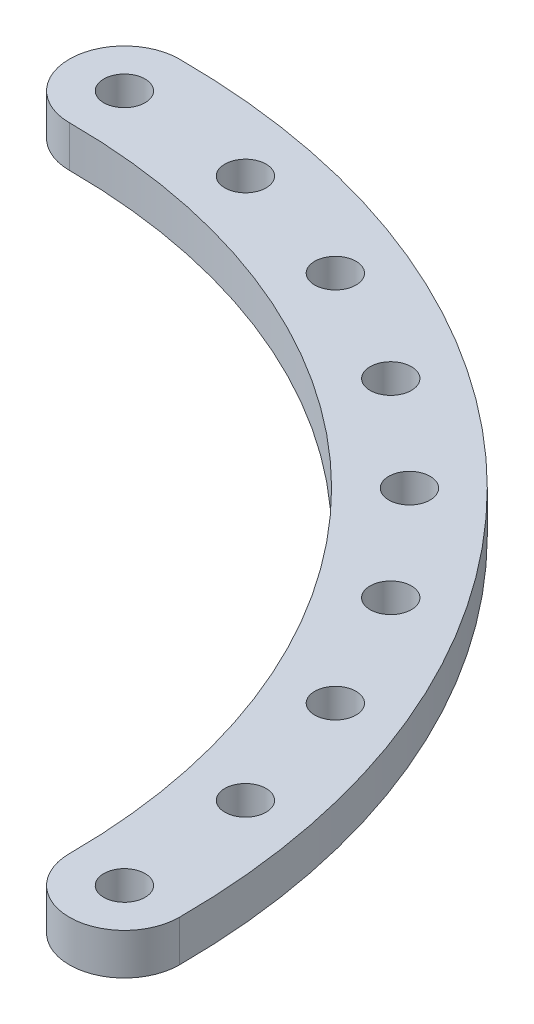
ISO-10303-21;
HEADER;
FILE_DESCRIPTION(('STEP AP214'),'2;1');
FILE_NAME('part.step','',(''),(''),'','','');
FILE_SCHEMA(('AUTOMOTIVE_DESIGN { 1 0 10303 214 1 1 1 1 }'));
ENDSEC;
DATA;
#1=APPLICATION_CONTEXT('core data for automotive mechanical design processes');
#2=APPLICATION_PROTOCOL_DEFINITION('international standard','automotive_design',2000,#1);
#3=PRODUCT_CONTEXT('',#1,'mechanical');
#4=PRODUCT('Part','Part','',(#3));
#5=PRODUCT_RELATED_PRODUCT_CATEGORY('part','',(#4));
#6=PRODUCT_DEFINITION_FORMATION('','',#4);
#7=PRODUCT_DEFINITION_CONTEXT('part definition',#1,'design');
#8=PRODUCT_DEFINITION('design','',#6,#7);
#9=PRODUCT_DEFINITION_SHAPE('','',#8);
#10=(LENGTH_UNIT() NAMED_UNIT(*) SI_UNIT(.MILLI.,.METRE.));
#11=(NAMED_UNIT(*) PLANE_ANGLE_UNIT() SI_UNIT($,.RADIAN.));
#12=(NAMED_UNIT(*) SI_UNIT($,.STERADIAN.) SOLID_ANGLE_UNIT());
#13=UNCERTAINTY_MEASURE_WITH_UNIT(LENGTH_MEASURE(1.E-05),#10,'distance_accuracy_value','');
#14=(GEOMETRIC_REPRESENTATION_CONTEXT(3) GLOBAL_UNCERTAINTY_ASSIGNED_CONTEXT((#13)) GLOBAL_UNIT_ASSIGNED_CONTEXT((#10,
#11,#12)) REPRESENTATION_CONTEXT('',''));
#15=CARTESIAN_POINT('',(0.,0.,0.));
#16=DIRECTION('',(0.,0.,1.));
#17=DIRECTION('',(1.,0.,0.));
#18=AXIS2_PLACEMENT_3D('',#15,#16,#17);
#19=CARTESIAN_POINT('',(0.,3.,0.));
#20=DIRECTION('',(0.,1.,0.));
#21=DIRECTION('',(0.,0.,1.));
#22=AXIS2_PLACEMENT_3D('',#19,#20,#21);
#23=PLANE('',#22);
#24=CARTESIAN_POINT('',(50.0000000000042,3.,-4.25254075506806E-12));
#25=DIRECTION('',(0.,1.,0.));
#26=DIRECTION('',(0.,0.,1.));
#27=AXIS2_PLACEMENT_3D('',#24,#25,#26);
#28=CIRCLE('',#27,1.5);
#29=CARTESIAN_POINT('',(50.0000000000042,3.,1.49999999999575));
#30=VERTEX_POINT('',#29);
#31=EDGE_CURVE('E94',#30,#30,#28,.T.);
#32=ORIENTED_EDGE('',*,*,#31,.F.);
#33=EDGE_LOOP('',(#32));
#34=FACE_BOUND('',#33,.T.);
#35=CARTESIAN_POINT('',(49.0392640201649,3.,-9.75451610081059));
#36=DIRECTION('',(0.,1.,0.));
#37=DIRECTION('',(0.,0.,1.));
#38=AXIS2_PLACEMENT_3D('',#35,#36,#37);
#39=CIRCLE('',#38,1.5);
#40=CARTESIAN_POINT('',(49.0392640201649,3.,-8.25451610081058));
#41=VERTEX_POINT('',#40);
#42=EDGE_CURVE('E96',#41,#41,#39,.T.);
#43=ORIENTED_EDGE('',*,*,#42,.F.);
#44=EDGE_LOOP('',(#43));
#45=FACE_BOUND('',#44,.T.);
#46=CARTESIAN_POINT('',(46.193976625567,3.,-19.1341716182584));
#47=DIRECTION('',(0.,1.,0.));
#48=DIRECTION('',(0.,0.,1.));
#49=AXIS2_PLACEMENT_3D('',#46,#47,#48);
#50=CIRCLE('',#49,1.5);
#51=CARTESIAN_POINT('',(46.193976625567,3.,-17.6341716182584));
#52=VERTEX_POINT('',#51);
#53=EDGE_CURVE('E145',#52,#52,#50,.T.);
#54=ORIENTED_EDGE('',*,*,#53,.F.);
#55=EDGE_LOOP('',(#54));
#56=FACE_BOUND('',#55,.T.);
#57=CARTESIAN_POINT('',(41.5734806151291,3.,-27.7785116509836));
#58=DIRECTION('',(0.,1.,0.));
#59=DIRECTION('',(0.,0.,1.));
#60=AXIS2_PLACEMENT_3D('',#57,#58,#59);
#61=CIRCLE('',#60,1.5);
#62=CARTESIAN_POINT('',(41.5734806151291,3.,-26.2785116509836));
#63=VERTEX_POINT('',#62);
#64=EDGE_CURVE('E142',#63,#63,#61,.T.);
#65=ORIENTED_EDGE('',*,*,#64,.F.);
#66=EDGE_LOOP('',(#65));
#67=FACE_BOUND('',#66,.T.);
#68=CARTESIAN_POINT('',(35.3553390593286,3.,-35.3553390593304));
#69=DIRECTION('',(0.,1.,0.));
#70=DIRECTION('',(0.,0.,1.));
#71=AXIS2_PLACEMENT_3D('',#68,#69,#70);
#72=CIRCLE('',#71,1.5);
#73=CARTESIAN_POINT('',(35.3553390593286,3.,-33.8553390593304));
#74=VERTEX_POINT('',#73);
#75=EDGE_CURVE('E139',#74,#74,#72,.T.);
#76=ORIENTED_EDGE('',*,*,#75,.F.);
#77=EDGE_LOOP('',(#76));
#78=FACE_BOUND('',#77,.T.);
#79=CARTESIAN_POINT('',(27.7785116509808,3.,-41.5734806151296));
#80=DIRECTION('',(0.,1.,0.));
#81=DIRECTION('',(0.,0.,1.));
#82=AXIS2_PLACEMENT_3D('',#79,#80,#81);
#83=CIRCLE('',#82,1.5000000000001);
#84=CARTESIAN_POINT('',(27.7785116509808,3.,-40.0734806151295));
#85=VERTEX_POINT('',#84);
#86=EDGE_CURVE('E136',#85,#85,#83,.T.);
#87=ORIENTED_EDGE('',*,*,#86,.F.);
#88=EDGE_LOOP('',(#87));
#89=FACE_BOUND('',#88,.T.);
#90=CARTESIAN_POINT('',(19.1341716182548,3.,-46.193976625566));
#91=DIRECTION('',(0.,1.,0.));
#92=DIRECTION('',(0.,0.,1.));
#93=AXIS2_PLACEMENT_3D('',#90,#91,#92);
#94=CIRCLE('',#93,1.5);
#95=CARTESIAN_POINT('',(19.1341716182548,3.,-44.693976625566));
#96=VERTEX_POINT('',#95);
#97=EDGE_CURVE('E133',#96,#96,#94,.T.);
#98=ORIENTED_EDGE('',*,*,#97,.F.);
#99=EDGE_LOOP('',(#98));
#100=FACE_BOUND('',#99,.T.);
#101=CARTESIAN_POINT('',(9.7545161008065,3.,-49.0392640201624));
#102=DIRECTION('',(0.,1.,0.));
#103=DIRECTION('',(0.,0.,1.));
#104=AXIS2_PLACEMENT_3D('',#101,#102,#103);
#105=CIRCLE('',#104,1.5);
#106=CARTESIAN_POINT('',(9.7545161008065,3.,-47.5392640201624));
#107=VERTEX_POINT('',#106);
#108=EDGE_CURVE('E130',#107,#107,#105,.T.);
#109=ORIENTED_EDGE('',*,*,#108,.F.);
#110=EDGE_LOOP('',(#109));
#111=FACE_BOUND('',#110,.T.);
#112=CARTESIAN_POINT('',(0.,3.,-50.));
#113=DIRECTION('',(0.,1.,0.));
#114=DIRECTION('',(0.,0.,1.));
#115=AXIS2_PLACEMENT_3D('',#112,#113,#114);
#116=CIRCLE('',#115,1.5);
#117=CARTESIAN_POINT('',(0.,3.,-48.5));
#118=VERTEX_POINT('',#117);
#119=EDGE_CURVE('E127',#118,#118,#116,.T.);
#120=ORIENTED_EDGE('',*,*,#119,.F.);
#121=EDGE_LOOP('',(#120));
#122=FACE_BOUND('',#121,.T.);
#123=CARTESIAN_POINT('',(0.,3.,0.));
#124=DIRECTION('',(0.,1.,0.));
#125=DIRECTION('',(0.,0.,1.));
#126=AXIS2_PLACEMENT_3D('',#123,#124,#125);
#127=CIRCLE('',#126,46.);
#128=CARTESIAN_POINT('',(46.,3.,-3.91233749466228E-12));
#129=VERTEX_POINT('',#128);
#130=CARTESIAN_POINT('',(0.,3.,-46.));
#131=VERTEX_POINT('',#130);
#132=EDGE_CURVE('E11',#129,#131,#127,.T.);
#133=ORIENTED_EDGE('',*,*,#132,.F.);
#134=CARTESIAN_POINT('',(50.0000000000042,3.,-4.25254075506806E-12));
#135=DIRECTION('',(0.,1.,0.));
#136=DIRECTION('',(0.,0.,1.));
#137=AXIS2_PLACEMENT_3D('',#134,#135,#136);
#138=CIRCLE('',#137,3.99999999999574);
#139=CARTESIAN_POINT('',(54.,3.,-4.59274401547312E-12));
#140=VERTEX_POINT('',#139);
#141=EDGE_CURVE('E52',#129,#140,#138,.T.);
#142=ORIENTED_EDGE('',*,*,#141,.T.);
#143=CARTESIAN_POINT('',(0.,3.,0.));
#144=DIRECTION('',(0.,1.,0.));
#145=DIRECTION('',(0.,0.,1.));
#146=AXIS2_PLACEMENT_3D('',#143,#144,#145);
#147=CIRCLE('',#146,54.);
#148=CARTESIAN_POINT('',(0.,3.,-54.));
#149=VERTEX_POINT('',#148);
#150=EDGE_CURVE('E44',#140,#149,#147,.T.);
#151=ORIENTED_EDGE('',*,*,#150,.T.);
#152=CARTESIAN_POINT('',(0.,3.,-50.));
#153=DIRECTION('',(0.,1.,0.));
#154=DIRECTION('',(0.,0.,1.));
#155=AXIS2_PLACEMENT_3D('',#152,#153,#154);
#156=CIRCLE('',#155,3.99999999999999);
#157=EDGE_CURVE('E154',#149,#131,#156,.T.);
#158=ORIENTED_EDGE('',*,*,#157,.T.);
#159=EDGE_LOOP('',(#133,#142,#151,#158));
#160=FACE_BOUND('',#159,.T.);
#161=ADVANCED_FACE('F35',(#34,#45,#56,#67,#78,#89,#100,#111,#122,#160),#23,.T.);
#162=CARTESIAN_POINT('',(0.,0.,0.));
#163=DIRECTION('',(0.,1.,0.));
#164=DIRECTION('',(0.,0.,1.));
#165=AXIS2_PLACEMENT_3D('',#162,#163,#164);
#166=PLANE('',#165);
#167=CARTESIAN_POINT('',(50.0000000000042,0.,-4.25254075506806E-12));
#168=DIRECTION('',(0.,1.,0.));
#169=DIRECTION('',(0.,0.,1.));
#170=AXIS2_PLACEMENT_3D('',#167,#168,#169);
#171=CIRCLE('',#170,1.5);
#172=CARTESIAN_POINT('',(50.0000000000042,0.,1.49999999999575));
#173=VERTEX_POINT('',#172);
#174=EDGE_CURVE('E123',#173,#173,#171,.T.);
#175=ORIENTED_EDGE('',*,*,#174,.T.);
#176=EDGE_LOOP('',(#175));
#177=FACE_BOUND('',#176,.T.);
#178=CARTESIAN_POINT('',(49.0392640201649,0.,-9.75451610081059));
#179=DIRECTION('',(0.,1.,0.));
#180=DIRECTION('',(0.,0.,1.));
#181=AXIS2_PLACEMENT_3D('',#178,#179,#180);
#182=CIRCLE('',#181,1.5);
#183=CARTESIAN_POINT('',(49.0392640201649,0.,-8.25451610081058));
#184=VERTEX_POINT('',#183);
#185=EDGE_CURVE('E120',#184,#184,#182,.T.);
#186=ORIENTED_EDGE('',*,*,#185,.T.);
#187=EDGE_LOOP('',(#186));
#188=FACE_BOUND('',#187,.T.);
#189=CARTESIAN_POINT('',(46.193976625567,0.,-19.1341716182584));
#190=DIRECTION('',(0.,1.,0.));
#191=DIRECTION('',(0.,0.,1.));
#192=AXIS2_PLACEMENT_3D('',#189,#190,#191);
#193=CIRCLE('',#192,1.5);
#194=CARTESIAN_POINT('',(46.193976625567,0.,-17.6341716182584));
#195=VERTEX_POINT('',#194);
#196=EDGE_CURVE('E117',#195,#195,#193,.T.);
#197=ORIENTED_EDGE('',*,*,#196,.T.);
#198=EDGE_LOOP('',(#197));
#199=FACE_BOUND('',#198,.T.);
#200=CARTESIAN_POINT('',(41.5734806151291,0.,-27.7785116509836));
#201=DIRECTION('',(0.,1.,0.));
#202=DIRECTION('',(0.,0.,1.));
#203=AXIS2_PLACEMENT_3D('',#200,#201,#202);
#204=CIRCLE('',#203,1.5);
#205=CARTESIAN_POINT('',(41.5734806151291,0.,-26.2785116509836));
#206=VERTEX_POINT('',#205);
#207=EDGE_CURVE('E114',#206,#206,#204,.T.);
#208=ORIENTED_EDGE('',*,*,#207,.T.);
#209=EDGE_LOOP('',(#208));
#210=FACE_BOUND('',#209,.T.);
#211=CARTESIAN_POINT('',(35.3553390593286,0.,-35.3553390593304));
#212=DIRECTION('',(0.,1.,0.));
#213=DIRECTION('',(0.,0.,1.));
#214=AXIS2_PLACEMENT_3D('',#211,#212,#213);
#215=CIRCLE('',#214,1.5);
#216=CARTESIAN_POINT('',(35.3553390593286,0.,-33.8553390593304));
#217=VERTEX_POINT('',#216);
#218=EDGE_CURVE('E111',#217,#217,#215,.T.);
#219=ORIENTED_EDGE('',*,*,#218,.T.);
#220=EDGE_LOOP('',(#219));
#221=FACE_BOUND('',#220,.T.);
#222=CARTESIAN_POINT('',(27.7785116509808,0.,-41.5734806151296));
#223=DIRECTION('',(0.,1.,0.));
#224=DIRECTION('',(0.,0.,1.));
#225=AXIS2_PLACEMENT_3D('',#222,#223,#224);
#226=CIRCLE('',#225,1.5000000000001);
#227=CARTESIAN_POINT('',(27.7785116509808,0.,-40.0734806151295));
#228=VERTEX_POINT('',#227);
#229=EDGE_CURVE('E108',#228,#228,#226,.T.);
#230=ORIENTED_EDGE('',*,*,#229,.T.);
#231=EDGE_LOOP('',(#230));
#232=FACE_BOUND('',#231,.T.);
#233=CARTESIAN_POINT('',(19.1341716182548,0.,-46.193976625566));
#234=DIRECTION('',(0.,1.,0.));
#235=DIRECTION('',(0.,0.,1.));
#236=AXIS2_PLACEMENT_3D('',#233,#234,#235);
#237=CIRCLE('',#236,1.5);
#238=CARTESIAN_POINT('',(19.1341716182548,0.,-44.693976625566));
#239=VERTEX_POINT('',#238);
#240=EDGE_CURVE('E105',#239,#239,#237,.T.);
#241=ORIENTED_EDGE('',*,*,#240,.T.);
#242=EDGE_LOOP('',(#241));
#243=FACE_BOUND('',#242,.T.);
#244=CARTESIAN_POINT('',(9.7545161008065,0.,-49.0392640201624));
#245=DIRECTION('',(0.,1.,0.));
#246=DIRECTION('',(0.,0.,1.));
#247=AXIS2_PLACEMENT_3D('',#244,#245,#246);
#248=CIRCLE('',#247,1.5);
#249=CARTESIAN_POINT('',(9.7545161008065,0.,-47.5392640201624));
#250=VERTEX_POINT('',#249);
#251=EDGE_CURVE('E100',#250,#250,#248,.T.);
#252=ORIENTED_EDGE('',*,*,#251,.T.);
#253=EDGE_LOOP('',(#252));
#254=FACE_BOUND('',#253,.T.);
#255=CARTESIAN_POINT('',(0.,0.,-50.));
#256=DIRECTION('',(0.,1.,0.));
#257=DIRECTION('',(0.,0.,1.));
#258=AXIS2_PLACEMENT_3D('',#255,#256,#257);
#259=CIRCLE('',#258,1.5);
#260=CARTESIAN_POINT('',(0.,0.,-48.5));
#261=VERTEX_POINT('',#260);
#262=EDGE_CURVE('E98',#261,#261,#259,.T.);
#263=ORIENTED_EDGE('',*,*,#262,.T.);
#264=EDGE_LOOP('',(#263));
#265=FACE_BOUND('',#264,.T.);
#266=CARTESIAN_POINT('',(50.0000000000042,0.,-4.25254075506806E-12));
#267=DIRECTION('',(0.,1.,0.));
#268=DIRECTION('',(0.,0.,1.));
#269=AXIS2_PLACEMENT_3D('',#266,#267,#268);
#270=CIRCLE('',#269,3.99999999999574);
#271=CARTESIAN_POINT('',(46.,0.,-3.91233749466228E-12));
#272=VERTEX_POINT('',#271);
#273=CARTESIAN_POINT('',(54.,0.,-4.59274401547312E-12));
#274=VERTEX_POINT('',#273);
#275=EDGE_CURVE('E79',#272,#274,#270,.T.);
#276=ORIENTED_EDGE('',*,*,#275,.F.);
#277=CARTESIAN_POINT('',(0.,0.,0.));
#278=DIRECTION('',(0.,1.,0.));
#279=DIRECTION('',(0.,0.,1.));
#280=AXIS2_PLACEMENT_3D('',#277,#278,#279);
#281=CIRCLE('',#280,46.);
#282=CARTESIAN_POINT('',(0.,0.,-46.));
#283=VERTEX_POINT('',#282);
#284=EDGE_CURVE('E39',#272,#283,#281,.T.);
#285=ORIENTED_EDGE('',*,*,#284,.T.);
#286=CARTESIAN_POINT('',(0.,0.,-50.));
#287=DIRECTION('',(0.,1.,0.));
#288=DIRECTION('',(0.,0.,1.));
#289=AXIS2_PLACEMENT_3D('',#286,#287,#288);
#290=CIRCLE('',#289,3.99999999999999);
#291=CARTESIAN_POINT('',(0.,0.,-54.));
#292=VERTEX_POINT('',#291);
#293=EDGE_CURVE('E152',#292,#283,#290,.T.);
#294=ORIENTED_EDGE('',*,*,#293,.F.);
#295=CARTESIAN_POINT('',(0.,0.,0.));
#296=DIRECTION('',(0.,1.,0.));
#297=DIRECTION('',(0.,0.,1.));
#298=AXIS2_PLACEMENT_3D('',#295,#296,#297);
#299=CIRCLE('',#298,54.);
#300=EDGE_CURVE('E60',#274,#292,#299,.T.);
#301=ORIENTED_EDGE('',*,*,#300,.F.);
#302=EDGE_LOOP('',(#276,#285,#294,#301));
#303=FACE_BOUND('',#302,.T.);
#304=ADVANCED_FACE('F86',(#177,#188,#199,#210,#221,#232,#243,#254,#265,#303),#166,.F.);
#305=CARTESIAN_POINT('',(0.,3.,0.));
#306=DIRECTION('',(0.,-1.,0.));
#307=DIRECTION('',(0.,0.,-1.));
#308=AXIS2_PLACEMENT_3D('',#305,#306,#307);
#309=CYLINDRICAL_SURFACE('',#308,54.);
#310=DIRECTION('',(0.,1.,0.));
#311=VECTOR('',#310,1.);
#312=CARTESIAN_POINT('',(54.,0.,-4.59274401547312E-12));
#313=LINE('',#312,#311);
#314=EDGE_CURVE('E83',#274,#140,#313,.T.);
#315=ORIENTED_EDGE('',*,*,#314,.F.);
#316=ORIENTED_EDGE('',*,*,#300,.T.);
#317=DIRECTION('',(0.,1.,0.));
#318=VECTOR('',#317,1.);
#319=CARTESIAN_POINT('',(0.,0.,-54.));
#320=LINE('',#319,#318);
#321=EDGE_CURVE('E150',#292,#149,#320,.T.);
#322=ORIENTED_EDGE('',*,*,#321,.T.);
#323=ORIENTED_EDGE('',*,*,#150,.F.);
#324=EDGE_LOOP('',(#315,#316,#322,#323));
#325=FACE_BOUND('',#324,.T.);
#326=ADVANCED_FACE('F162',(#325),#309,.T.);
#327=CARTESIAN_POINT('',(0.,3.,0.));
#328=DIRECTION('',(0.,-1.,0.));
#329=DIRECTION('',(0.,0.,-1.));
#330=AXIS2_PLACEMENT_3D('',#327,#328,#329);
#331=CYLINDRICAL_SURFACE('',#330,46.);
#332=ORIENTED_EDGE('',*,*,#284,.F.);
#333=DIRECTION('',(0.,1.,0.));
#334=VECTOR('',#333,1.);
#335=CARTESIAN_POINT('',(46.,0.,-3.91233749466228E-12));
#336=LINE('',#335,#334);
#337=EDGE_CURVE('E76',#272,#129,#336,.T.);
#338=ORIENTED_EDGE('',*,*,#337,.T.);
#339=ORIENTED_EDGE('',*,*,#132,.T.);
#340=DIRECTION('',(0.,1.,0.));
#341=VECTOR('',#340,1.);
#342=CARTESIAN_POINT('',(0.,0.,-46.));
#343=LINE('',#342,#341);
#344=EDGE_CURVE('E93',#283,#131,#343,.T.);
#345=ORIENTED_EDGE('',*,*,#344,.F.);
#346=EDGE_LOOP('',(#332,#338,#339,#345));
#347=FACE_BOUND('',#346,.T.);
#348=ADVANCED_FACE('F91',(#347),#331,.F.);
#349=CARTESIAN_POINT('',(0.,3.,-50.));
#350=DIRECTION('',(0.,-1.,0.));
#351=DIRECTION('',(0.,0.,-1.));
#352=AXIS2_PLACEMENT_3D('',#349,#350,#351);
#353=CYLINDRICAL_SURFACE('',#352,1.5);
#354=ORIENTED_EDGE('',*,*,#119,.T.);
#355=EDGE_LOOP('',(#354));
#356=FACE_BOUND('',#355,.T.);
#357=ORIENTED_EDGE('',*,*,#262,.F.);
#358=EDGE_LOOP('',(#357));
#359=FACE_BOUND('',#358,.T.);
#360=ADVANCED_FACE('F187',(#356,#359),#353,.F.);
#361=CARTESIAN_POINT('',(9.7545161008065,3.,-49.0392640201624));
#362=DIRECTION('',(0.,-1.,0.));
#363=DIRECTION('',(0.,0.,-1.));
#364=AXIS2_PLACEMENT_3D('',#361,#362,#363);
#365=CYLINDRICAL_SURFACE('',#364,1.5);
#366=ORIENTED_EDGE('',*,*,#108,.T.);
#367=EDGE_LOOP('',(#366));
#368=FACE_BOUND('',#367,.T.);
#369=ORIENTED_EDGE('',*,*,#251,.F.);
#370=EDGE_LOOP('',(#369));
#371=FACE_BOUND('',#370,.T.);
#372=ADVANCED_FACE('F192',(#368,#371),#365,.F.);
#373=CARTESIAN_POINT('',(19.1341716182548,3.,-46.193976625566));
#374=DIRECTION('',(0.,-1.,0.));
#375=DIRECTION('',(0.,0.,-1.));
#376=AXIS2_PLACEMENT_3D('',#373,#374,#375);
#377=CYLINDRICAL_SURFACE('',#376,1.5);
#378=ORIENTED_EDGE('',*,*,#97,.T.);
#379=EDGE_LOOP('',(#378));
#380=FACE_BOUND('',#379,.T.);
#381=ORIENTED_EDGE('',*,*,#240,.F.);
#382=EDGE_LOOP('',(#381));
#383=FACE_BOUND('',#382,.T.);
#384=ADVANCED_FACE('F196',(#380,#383),#377,.F.);
#385=CARTESIAN_POINT('',(27.7785116509808,3.,-41.5734806151296));
#386=DIRECTION('',(0.,-1.,0.));
#387=DIRECTION('',(0.,0.,-1.));
#388=AXIS2_PLACEMENT_3D('',#385,#386,#387);
#389=CYLINDRICAL_SURFACE('',#388,1.5000000000001);
#390=ORIENTED_EDGE('',*,*,#86,.T.);
#391=EDGE_LOOP('',(#390));
#392=FACE_BOUND('',#391,.T.);
#393=ORIENTED_EDGE('',*,*,#229,.F.);
#394=EDGE_LOOP('',(#393));
#395=FACE_BOUND('',#394,.T.);
#396=ADVANCED_FACE('F200',(#392,#395),#389,.F.);
#397=CARTESIAN_POINT('',(35.3553390593286,3.,-35.3553390593304));
#398=DIRECTION('',(0.,-1.,0.));
#399=DIRECTION('',(0.,0.,-1.));
#400=AXIS2_PLACEMENT_3D('',#397,#398,#399);
#401=CYLINDRICAL_SURFACE('',#400,1.5);
#402=ORIENTED_EDGE('',*,*,#75,.T.);
#403=EDGE_LOOP('',(#402));
#404=FACE_BOUND('',#403,.T.);
#405=ORIENTED_EDGE('',*,*,#218,.F.);
#406=EDGE_LOOP('',(#405));
#407=FACE_BOUND('',#406,.T.);
#408=ADVANCED_FACE('F204',(#404,#407),#401,.F.);
#409=CARTESIAN_POINT('',(41.5734806151291,3.,-27.7785116509836));
#410=DIRECTION('',(0.,-1.,0.));
#411=DIRECTION('',(0.,0.,-1.));
#412=AXIS2_PLACEMENT_3D('',#409,#410,#411);
#413=CYLINDRICAL_SURFACE('',#412,1.5);
#414=ORIENTED_EDGE('',*,*,#64,.T.);
#415=EDGE_LOOP('',(#414));
#416=FACE_BOUND('',#415,.T.);
#417=ORIENTED_EDGE('',*,*,#207,.F.);
#418=EDGE_LOOP('',(#417));
#419=FACE_BOUND('',#418,.T.);
#420=ADVANCED_FACE('F208',(#416,#419),#413,.F.);
#421=CARTESIAN_POINT('',(46.193976625567,3.,-19.1341716182584));
#422=DIRECTION('',(0.,-1.,0.));
#423=DIRECTION('',(0.,0.,-1.));
#424=AXIS2_PLACEMENT_3D('',#421,#422,#423);
#425=CYLINDRICAL_SURFACE('',#424,1.5);
#426=ORIENTED_EDGE('',*,*,#53,.T.);
#427=EDGE_LOOP('',(#426));
#428=FACE_BOUND('',#427,.T.);
#429=ORIENTED_EDGE('',*,*,#196,.F.);
#430=EDGE_LOOP('',(#429));
#431=FACE_BOUND('',#430,.T.);
#432=ADVANCED_FACE('F212',(#428,#431),#425,.F.);
#433=CARTESIAN_POINT('',(49.0392640201649,3.,-9.75451610081059));
#434=DIRECTION('',(0.,-1.,0.));
#435=DIRECTION('',(0.,0.,-1.));
#436=AXIS2_PLACEMENT_3D('',#433,#434,#435);
#437=CYLINDRICAL_SURFACE('',#436,1.5);
#438=ORIENTED_EDGE('',*,*,#42,.T.);
#439=EDGE_LOOP('',(#438));
#440=FACE_BOUND('',#439,.T.);
#441=ORIENTED_EDGE('',*,*,#185,.F.);
#442=EDGE_LOOP('',(#441));
#443=FACE_BOUND('',#442,.T.);
#444=ADVANCED_FACE('F172',(#440,#443),#437,.F.);
#445=CARTESIAN_POINT('',(50.0000000000042,3.,-4.25254075506806E-12));
#446=DIRECTION('',(0.,-1.,0.));
#447=DIRECTION('',(0.,0.,-1.));
#448=AXIS2_PLACEMENT_3D('',#445,#446,#447);
#449=CYLINDRICAL_SURFACE('',#448,1.5);
#450=ORIENTED_EDGE('',*,*,#31,.T.);
#451=EDGE_LOOP('',(#450));
#452=FACE_BOUND('',#451,.T.);
#453=ORIENTED_EDGE('',*,*,#174,.F.);
#454=EDGE_LOOP('',(#453));
#455=FACE_BOUND('',#454,.T.);
#456=ADVANCED_FACE('F37',(#452,#455),#449,.F.);
#457=CARTESIAN_POINT('',(0.,0.,-50.));
#458=DIRECTION('',(0.,1.,0.));
#459=DIRECTION('',(0.,0.,1.));
#460=AXIS2_PLACEMENT_3D('',#457,#458,#459);
#461=CYLINDRICAL_SURFACE('',#460,3.99999999999999);
#462=ORIENTED_EDGE('',*,*,#157,.F.);
#463=ORIENTED_EDGE('',*,*,#321,.F.);
#464=ORIENTED_EDGE('',*,*,#293,.T.);
#465=ORIENTED_EDGE('',*,*,#344,.T.);
#466=EDGE_LOOP('',(#462,#463,#464,#465));
#467=FACE_BOUND('',#466,.T.);
#468=ADVANCED_FACE('F164',(#467),#461,.T.);
#469=CARTESIAN_POINT('',(50.0000000000042,0.,-4.25254075506806E-12));
#470=DIRECTION('',(0.,1.,0.));
#471=DIRECTION('',(0.,0.,1.));
#472=AXIS2_PLACEMENT_3D('',#469,#470,#471);
#473=CYLINDRICAL_SURFACE('',#472,3.99999999999574);
#474=ORIENTED_EDGE('',*,*,#141,.F.);
#475=ORIENTED_EDGE('',*,*,#337,.F.);
#476=ORIENTED_EDGE('',*,*,#275,.T.);
#477=ORIENTED_EDGE('',*,*,#314,.T.);
#478=EDGE_LOOP('',(#474,#475,#476,#477));
#479=FACE_BOUND('',#478,.T.);
#480=ADVANCED_FACE('F78',(#479),#473,.T.);
#481=CLOSED_SHELL('',(#161,#304,#326,#348,#360,#372,#384,#396,#408,#420,#432,#444,#456,#468,#480));
#482=MANIFOLD_SOLID_BREP('B2',#481);
#483=ADVANCED_BREP_SHAPE_REPRESENTATION('',(#18,#482),#14);
#484=SHAPE_DEFINITION_REPRESENTATION(#9,#483);
ENDSEC;
END-ISO-10303-21;
